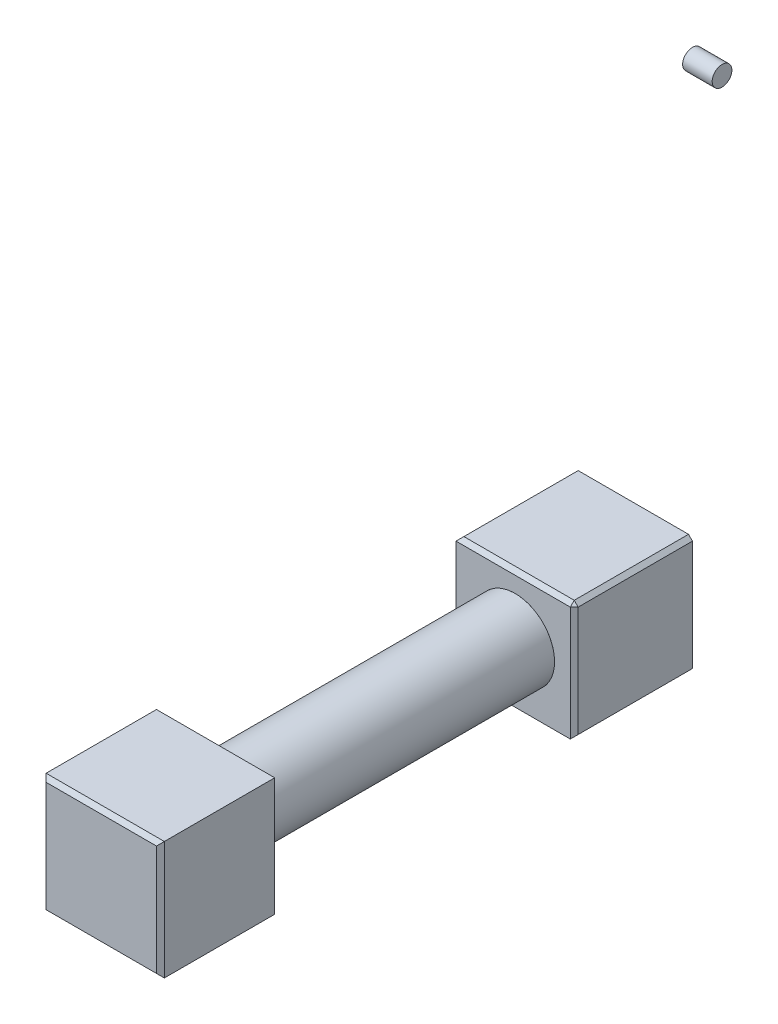
ISO-10303-21;
HEADER;
FILE_DESCRIPTION(('STEP AP214'),'2;1');
FILE_NAME('part.step','',(''),(''),'','','');
FILE_SCHEMA(('AUTOMOTIVE_DESIGN { 1 0 10303 214 1 1 1 1 }'));
ENDSEC;
DATA;
#1=APPLICATION_CONTEXT('core data for automotive mechanical design processes');
#2=APPLICATION_PROTOCOL_DEFINITION('international standard','automotive_design',2000,#1);
#3=PRODUCT_CONTEXT('',#1,'mechanical');
#4=PRODUCT('Part','Part','',(#3));
#5=PRODUCT_RELATED_PRODUCT_CATEGORY('part','',(#4));
#6=PRODUCT_DEFINITION_FORMATION('','',#4);
#7=PRODUCT_DEFINITION_CONTEXT('part definition',#1,'design');
#8=PRODUCT_DEFINITION('design','',#6,#7);
#9=PRODUCT_DEFINITION_SHAPE('','',#8);
#10=(LENGTH_UNIT() NAMED_UNIT(*) SI_UNIT(.MILLI.,.METRE.));
#11=(NAMED_UNIT(*) PLANE_ANGLE_UNIT() SI_UNIT($,.RADIAN.));
#12=(NAMED_UNIT(*) SI_UNIT($,.STERADIAN.) SOLID_ANGLE_UNIT());
#13=UNCERTAINTY_MEASURE_WITH_UNIT(LENGTH_MEASURE(1.E-05),#10,'distance_accuracy_value','');
#14=(GEOMETRIC_REPRESENTATION_CONTEXT(3) GLOBAL_UNCERTAINTY_ASSIGNED_CONTEXT((#13)) GLOBAL_UNIT_ASSIGNED_CONTEXT((#10,
#11,#12)) REPRESENTATION_CONTEXT('',''));
#15=CARTESIAN_POINT('',(0.,0.,0.));
#16=DIRECTION('',(0.,0.,1.));
#17=DIRECTION('',(1.,0.,0.));
#18=AXIS2_PLACEMENT_3D('',#15,#16,#17);
#19=CARTESIAN_POINT('',(45.,240.,0.));
#20=DIRECTION('',(-1.,0.,0.));
#21=DIRECTION('',(0.,0.,1.));
#22=AXIS2_PLACEMENT_3D('',#19,#20,#21);
#23=CYLINDRICAL_SURFACE('',#22,5.);
#24=CARTESIAN_POINT('',(45.,240.,0.));
#25=DIRECTION('',(1.,0.,0.));
#26=DIRECTION('',(0.,0.,-1.));
#27=AXIS2_PLACEMENT_3D('',#24,#25,#26);
#28=CIRCLE('',#27,5.);
#29=CARTESIAN_POINT('',(45.,240.,-5.));
#30=VERTEX_POINT('',#29);
#31=EDGE_CURVE('E11',#30,#30,#28,.T.);
#32=ORIENTED_EDGE('',*,*,#31,.F.);
#33=EDGE_LOOP('',(#32));
#34=FACE_BOUND('',#33,.T.);
#35=CARTESIAN_POINT('',(30.,240.,0.));
#36=DIRECTION('',(1.,0.,0.));
#37=DIRECTION('',(0.,0.,-1.));
#38=AXIS2_PLACEMENT_3D('',#35,#36,#37);
#39=CIRCLE('',#38,5.);
#40=CARTESIAN_POINT('',(30.,240.,-5.));
#41=VERTEX_POINT('',#40);
#42=EDGE_CURVE('E52',#41,#41,#39,.T.);
#43=ORIENTED_EDGE('',*,*,#42,.T.);
#44=EDGE_LOOP('',(#43));
#45=FACE_BOUND('',#44,.T.);
#46=ADVANCED_FACE('F49',(#34,#45),#23,.T.);
#47=CARTESIAN_POINT('',(45.,240.,0.));
#48=DIRECTION('',(1.,0.,0.));
#49=DIRECTION('',(0.,0.,-1.));
#50=AXIS2_PLACEMENT_3D('',#47,#48,#49);
#51=PLANE('',#50);
#52=ORIENTED_EDGE('',*,*,#31,.T.);
#53=EDGE_LOOP('',(#52));
#54=FACE_BOUND('',#53,.T.);
#55=ADVANCED_FACE('F65',(#54),#51,.T.);
#56=CARTESIAN_POINT('',(30.,240.,0.));
#57=DIRECTION('',(1.,0.,0.));
#58=DIRECTION('',(0.,0.,-1.));
#59=AXIS2_PLACEMENT_3D('',#56,#57,#58);
#60=PLANE('',#59);
#61=ORIENTED_EDGE('',*,*,#42,.F.);
#62=EDGE_LOOP('',(#61));
#63=FACE_BOUND('',#62,.T.);
#64=ADVANCED_FACE('F64',(#63),#60,.F.);
#65=CLOSED_SHELL('',(#46,#55,#64));
#66=MANIFOLD_SOLID_BREP('B2',#65);
#67=CARTESIAN_POINT('',(0.,0.,210.));
#68=DIRECTION('',(0.,0.,-1.));
#69=DIRECTION('',(-1.,0.,0.));
#70=AXIS2_PLACEMENT_3D('',#67,#68,#69);
#71=CYLINDRICAL_SURFACE('',#70,20.);
#72=CARTESIAN_POINT('',(0.,0.,210.));
#73=DIRECTION('',(0.,0.,1.));
#74=DIRECTION('',(1.,0.,0.));
#75=AXIS2_PLACEMENT_3D('',#72,#73,#74);
#76=CIRCLE('',#75,20.);
#77=CARTESIAN_POINT('',(20.,0.,210.));
#78=VERTEX_POINT('',#77);
#79=EDGE_CURVE('E184',#78,#78,#76,.T.);
#80=ORIENTED_EDGE('',*,*,#79,.F.);
#81=EDGE_LOOP('',(#80));
#82=FACE_BOUND('',#81,.T.);
#83=CARTESIAN_POINT('',(0.,0.,60.));
#84=DIRECTION('',(0.,0.,1.));
#85=DIRECTION('',(1.,0.,0.));
#86=AXIS2_PLACEMENT_3D('',#83,#84,#85);
#87=CIRCLE('',#86,20.);
#88=CARTESIAN_POINT('',(20.,0.,60.));
#89=VERTEX_POINT('',#88);
#90=EDGE_CURVE('E252',#89,#89,#87,.T.);
#91=ORIENTED_EDGE('',*,*,#90,.T.);
#92=EDGE_LOOP('',(#91));
#93=FACE_BOUND('',#92,.T.);
#94=ADVANCED_FACE('F99',(#82,#93),#71,.T.);
#95=CARTESIAN_POINT('',(0.,0.,60.));
#96=DIRECTION('',(0.,0.,1.));
#97=DIRECTION('',(1.,0.,0.));
#98=AXIS2_PLACEMENT_3D('',#95,#96,#97);
#99=PLANE('',#98);
#100=ORIENTED_EDGE('',*,*,#90,.F.);
#101=EDGE_LOOP('',(#100));
#102=FACE_BOUND('',#101,.T.);
#103=ADVANCED_FACE('F277',(#102),#99,.F.);
#104=CARTESIAN_POINT('',(30.,-30.,270.));
#105=DIRECTION('',(-1.,0.,0.));
#106=DIRECTION('',(0.,0.,1.));
#107=AXIS2_PLACEMENT_3D('',#104,#105,#106);
#108=PLANE('',#107);
#109=DIRECTION('',(0.,0.,-1.));
#110=VECTOR('',#109,1.);
#111=CARTESIAN_POINT('',(30.,30.,270.));
#112=LINE('',#111,#110);
#113=CARTESIAN_POINT('',(30.,30.,268.));
#114=VERTEX_POINT('',#113);
#115=CARTESIAN_POINT('',(30.,30.,212.));
#116=VERTEX_POINT('',#115);
#117=EDGE_CURVE('E250',#114,#116,#112,.T.);
#118=ORIENTED_EDGE('',*,*,#117,.F.);
#119=DIRECTION('',(0.,-1.,0.));
#120=VECTOR('',#119,1.);
#121=CARTESIAN_POINT('',(30.,-30.,268.));
#122=LINE('',#121,#120);
#123=CARTESIAN_POINT('',(30.,-30.,268.));
#124=VERTEX_POINT('',#123);
#125=EDGE_CURVE('E209',#114,#124,#122,.T.);
#126=ORIENTED_EDGE('',*,*,#125,.T.);
#127=DIRECTION('',(0.,0.,-1.));
#128=VECTOR('',#127,1.);
#129=CARTESIAN_POINT('',(30.,-30.,270.));
#130=LINE('',#129,#128);
#131=CARTESIAN_POINT('',(30.,-30.,212.));
#132=VERTEX_POINT('',#131);
#133=EDGE_CURVE('E238',#124,#132,#130,.T.);
#134=ORIENTED_EDGE('',*,*,#133,.T.);
#135=DIRECTION('',(0.,1.,0.));
#136=VECTOR('',#135,1.);
#137=CARTESIAN_POINT('',(30.,30.,212.));
#138=LINE('',#137,#136);
#139=EDGE_CURVE('E208',#132,#116,#138,.T.);
#140=ORIENTED_EDGE('',*,*,#139,.T.);
#141=EDGE_LOOP('',(#118,#126,#134,#140));
#142=FACE_BOUND('',#141,.T.);
#143=ADVANCED_FACE('F282',(#142),#108,.F.);
#144=CARTESIAN_POINT('',(-30.,30.,270.));
#145=DIRECTION('',(0.,-1.,0.));
#146=DIRECTION('',(0.,0.,-1.));
#147=AXIS2_PLACEMENT_3D('',#144,#145,#146);
#148=PLANE('',#147);
#149=DIRECTION('',(0.,0.,-1.));
#150=VECTOR('',#149,1.);
#151=CARTESIAN_POINT('',(-30.,30.,270.));
#152=LINE('',#151,#150);
#153=CARTESIAN_POINT('',(-30.,30.,268.));
#154=VERTEX_POINT('',#153);
#155=CARTESIAN_POINT('',(-30.,30.,212.));
#156=VERTEX_POINT('',#155);
#157=EDGE_CURVE('E248',#154,#156,#152,.T.);
#158=ORIENTED_EDGE('',*,*,#157,.F.);
#159=DIRECTION('',(1.,0.,0.));
#160=VECTOR('',#159,1.);
#161=CARTESIAN_POINT('',(-30.,30.,268.));
#162=LINE('',#161,#160);
#163=EDGE_CURVE('E206',#154,#114,#162,.T.);
#164=ORIENTED_EDGE('',*,*,#163,.T.);
#165=ORIENTED_EDGE('',*,*,#117,.T.);
#166=DIRECTION('',(-1.,0.,0.));
#167=VECTOR('',#166,1.);
#168=CARTESIAN_POINT('',(-30.,30.,212.));
#169=LINE('',#168,#167);
#170=EDGE_CURVE('E204',#116,#156,#169,.T.);
#171=ORIENTED_EDGE('',*,*,#170,.T.);
#172=EDGE_LOOP('',(#158,#164,#165,#171));
#173=FACE_BOUND('',#172,.T.);
#174=ADVANCED_FACE('F321',(#173),#148,.F.);
#175=CARTESIAN_POINT('',(-30.,-30.,270.));
#176=DIRECTION('',(1.,0.,0.));
#177=DIRECTION('',(0.,0.,-1.));
#178=AXIS2_PLACEMENT_3D('',#175,#176,#177);
#179=PLANE('',#178);
#180=DIRECTION('',(0.,0.,-1.));
#181=VECTOR('',#180,1.);
#182=CARTESIAN_POINT('',(-30.,-30.,270.));
#183=LINE('',#182,#181);
#184=CARTESIAN_POINT('',(-30.,-30.,268.));
#185=VERTEX_POINT('',#184);
#186=CARTESIAN_POINT('',(-30.,-30.,212.));
#187=VERTEX_POINT('',#186);
#188=EDGE_CURVE('E242',#185,#187,#183,.T.);
#189=ORIENTED_EDGE('',*,*,#188,.F.);
#190=DIRECTION('',(0.,1.,0.));
#191=VECTOR('',#190,1.);
#192=CARTESIAN_POINT('',(-30.,-30.,268.));
#193=LINE('',#192,#191);
#194=EDGE_CURVE('E205',#185,#154,#193,.T.);
#195=ORIENTED_EDGE('',*,*,#194,.T.);
#196=ORIENTED_EDGE('',*,*,#157,.T.);
#197=DIRECTION('',(0.,-1.,0.));
#198=VECTOR('',#197,1.);
#199=CARTESIAN_POINT('',(-30.,-30.,212.));
#200=LINE('',#199,#198);
#201=EDGE_CURVE('E200',#156,#187,#200,.T.);
#202=ORIENTED_EDGE('',*,*,#201,.T.);
#203=EDGE_LOOP('',(#189,#195,#196,#202));
#204=FACE_BOUND('',#203,.T.);
#205=ADVANCED_FACE('F266',(#204),#179,.F.);
#206=CARTESIAN_POINT('',(-30.,-30.,270.));
#207=DIRECTION('',(0.,1.,0.));
#208=DIRECTION('',(0.,0.,1.));
#209=AXIS2_PLACEMENT_3D('',#206,#207,#208);
#210=PLANE('',#209);
#211=ORIENTED_EDGE('',*,*,#133,.F.);
#212=DIRECTION('',(-1.,0.,0.));
#213=VECTOR('',#212,1.);
#214=CARTESIAN_POINT('',(-30.,-30.,268.));
#215=LINE('',#214,#213);
#216=EDGE_CURVE('E171',#124,#185,#215,.T.);
#217=ORIENTED_EDGE('',*,*,#216,.T.);
#218=ORIENTED_EDGE('',*,*,#188,.T.);
#219=DIRECTION('',(0.707106781186548,0.,-0.707106781186548));
#220=VECTOR('',#219,1.);
#221=CARTESIAN_POINT('',(-30.,-30.,212.));
#222=LINE('',#221,#220);
#223=CARTESIAN_POINT('',(-28.,-30.,210.));
#224=VERTEX_POINT('',#223);
#225=EDGE_CURVE('E194',#187,#224,#222,.T.);
#226=ORIENTED_EDGE('',*,*,#225,.T.);
#227=DIRECTION('',(1.,0.,0.));
#228=VECTOR('',#227,1.);
#229=CARTESIAN_POINT('',(-30.,-30.,210.));
#230=LINE('',#229,#228);
#231=CARTESIAN_POINT('',(28.,-30.,210.));
#232=VERTEX_POINT('',#231);
#233=EDGE_CURVE('E218',#224,#232,#230,.T.);
#234=ORIENTED_EDGE('',*,*,#233,.T.);
#235=DIRECTION('',(0.707106781186548,0.,0.707106781186548));
#236=VECTOR('',#235,1.);
#237=CARTESIAN_POINT('',(30.,-30.,212.));
#238=LINE('',#237,#236);
#239=EDGE_CURVE('E190',#232,#132,#238,.T.);
#240=ORIENTED_EDGE('',*,*,#239,.T.);
#241=EDGE_LOOP('',(#211,#217,#218,#226,#234,#240));
#242=FACE_BOUND('',#241,.T.);
#243=ADVANCED_FACE('F240',(#242),#210,.F.);
#244=CARTESIAN_POINT('',(0.,0.,270.));
#245=DIRECTION('',(0.,0.,-1.));
#246=DIRECTION('',(-1.,0.,0.));
#247=AXIS2_PLACEMENT_3D('',#244,#245,#246);
#248=PLANE('',#247);
#249=DIRECTION('',(0.,-1.,0.));
#250=VECTOR('',#249,1.);
#251=CARTESIAN_POINT('',(-28.,0.,270.));
#252=LINE('',#251,#250);
#253=CARTESIAN_POINT('',(-28.,28.,270.));
#254=VERTEX_POINT('',#253);
#255=CARTESIAN_POINT('',(-28.,-28.,270.));
#256=VERTEX_POINT('',#255);
#257=EDGE_CURVE('E189',#254,#256,#252,.T.);
#258=ORIENTED_EDGE('',*,*,#257,.T.);
#259=DIRECTION('',(1.,0.,0.));
#260=VECTOR('',#259,1.);
#261=CARTESIAN_POINT('',(0.,-28.,270.));
#262=LINE('',#261,#260);
#263=CARTESIAN_POINT('',(28.,-28.,270.));
#264=VERTEX_POINT('',#263);
#265=EDGE_CURVE('E166',#256,#264,#262,.T.);
#266=ORIENTED_EDGE('',*,*,#265,.T.);
#267=DIRECTION('',(0.,1.,0.));
#268=VECTOR('',#267,1.);
#269=CARTESIAN_POINT('',(28.,0.,270.));
#270=LINE('',#269,#268);
#271=CARTESIAN_POINT('',(28.,28.,270.));
#272=VERTEX_POINT('',#271);
#273=EDGE_CURVE('E179',#264,#272,#270,.T.);
#274=ORIENTED_EDGE('',*,*,#273,.T.);
#275=DIRECTION('',(-1.,0.,0.));
#276=VECTOR('',#275,1.);
#277=CARTESIAN_POINT('',(0.,28.,270.));
#278=LINE('',#277,#276);
#279=EDGE_CURVE('E181',#272,#254,#278,.T.);
#280=ORIENTED_EDGE('',*,*,#279,.T.);
#281=EDGE_LOOP('',(#258,#266,#274,#280));
#282=FACE_BOUND('',#281,.T.);
#283=ADVANCED_FACE('F186',(#282),#248,.F.);
#284=CARTESIAN_POINT('',(0.,0.,210.));
#285=DIRECTION('',(0.,0.,-1.));
#286=DIRECTION('',(-1.,0.,0.));
#287=AXIS2_PLACEMENT_3D('',#284,#285,#286);
#288=PLANE('',#287);
#289=ORIENTED_EDGE('',*,*,#79,.T.);
#290=EDGE_LOOP('',(#289));
#291=FACE_BOUND('',#290,.T.);
#292=ORIENTED_EDGE('',*,*,#233,.F.);
#293=DIRECTION('',(0.,1.,0.));
#294=VECTOR('',#293,1.);
#295=CARTESIAN_POINT('',(-28.,30.,210.));
#296=LINE('',#295,#294);
#297=CARTESIAN_POINT('',(-28.,28.,210.));
#298=VERTEX_POINT('',#297);
#299=EDGE_CURVE('E48',#224,#298,#296,.T.);
#300=ORIENTED_EDGE('',*,*,#299,.T.);
#301=DIRECTION('',(1.,0.,0.));
#302=VECTOR('',#301,1.);
#303=CARTESIAN_POINT('',(30.,28.,210.));
#304=LINE('',#303,#302);
#305=CARTESIAN_POINT('',(28.,28.,210.));
#306=VERTEX_POINT('',#305);
#307=EDGE_CURVE('E109',#298,#306,#304,.T.);
#308=ORIENTED_EDGE('',*,*,#307,.T.);
#309=DIRECTION('',(0.,-1.,0.));
#310=VECTOR('',#309,1.);
#311=CARTESIAN_POINT('',(28.,-30.,210.));
#312=LINE('',#311,#310);
#313=EDGE_CURVE('E215',#306,#232,#312,.T.);
#314=ORIENTED_EDGE('',*,*,#313,.T.);
#315=EDGE_LOOP('',(#292,#300,#308,#314));
#316=FACE_BOUND('',#315,.T.);
#317=ADVANCED_FACE('F235',(#291,#316),#288,.T.);
#318=CARTESIAN_POINT('',(0.,28.,270.));
#319=DIRECTION('',(0.,-0.707106781186547,-0.707106781186547));
#320=DIRECTION('',(-1.,0.,0.));
#321=AXIS2_PLACEMENT_3D('',#318,#319,#320);
#322=PLANE('',#321);
#323=DIRECTION('',(-0.577350269189626,-0.577350269189626,0.577350269189626));
#324=VECTOR('',#323,1.);
#325=CARTESIAN_POINT('',(18.6666666666667,18.6666666666667,279.333333333333));
#326=LINE('',#325,#324);
#327=EDGE_CURVE('E176',#114,#272,#326,.T.);
#328=ORIENTED_EDGE('',*,*,#327,.F.);
#329=ORIENTED_EDGE('',*,*,#163,.F.);
#330=DIRECTION('',(0.577350269189626,-0.577350269189626,0.577350269189626));
#331=VECTOR('',#330,1.);
#332=CARTESIAN_POINT('',(-18.6666666666667,18.6666666666667,279.333333333333));
#333=LINE('',#332,#331);
#334=EDGE_CURVE('E220',#254,#154,#333,.F.);
#335=ORIENTED_EDGE('',*,*,#334,.F.);
#336=ORIENTED_EDGE('',*,*,#279,.F.);
#337=EDGE_LOOP('',(#328,#329,#335,#336));
#338=FACE_BOUND('',#337,.T.);
#339=ADVANCED_FACE('F259',(#338),#322,.F.);
#340=CARTESIAN_POINT('',(-28.,0.,270.));
#341=DIRECTION('',(0.707106781186547,0.,-0.707106781186547));
#342=DIRECTION('',(0.,-1.,0.));
#343=AXIS2_PLACEMENT_3D('',#340,#341,#342);
#344=PLANE('',#343);
#345=ORIENTED_EDGE('',*,*,#334,.T.);
#346=ORIENTED_EDGE('',*,*,#194,.F.);
#347=DIRECTION('',(0.577350269189626,0.577350269189626,0.577350269189626));
#348=VECTOR('',#347,1.);
#349=CARTESIAN_POINT('',(-18.6666666666667,-18.6666666666667,279.333333333333));
#350=LINE('',#349,#348);
#351=EDGE_CURVE('E173',#256,#185,#350,.F.);
#352=ORIENTED_EDGE('',*,*,#351,.F.);
#353=ORIENTED_EDGE('',*,*,#257,.F.);
#354=EDGE_LOOP('',(#345,#346,#352,#353));
#355=FACE_BOUND('',#354,.T.);
#356=ADVANCED_FACE('F265',(#355),#344,.F.);
#357=CARTESIAN_POINT('',(28.,0.,270.));
#358=DIRECTION('',(-0.707106781186547,0.,-0.707106781186547));
#359=DIRECTION('',(0.,1.,0.));
#360=AXIS2_PLACEMENT_3D('',#357,#358,#359);
#361=PLANE('',#360);
#362=ORIENTED_EDGE('',*,*,#327,.T.);
#363=ORIENTED_EDGE('',*,*,#273,.F.);
#364=DIRECTION('',(0.577350269189626,-0.577350269189626,-0.577350269189626));
#365=VECTOR('',#364,1.);
#366=CARTESIAN_POINT('',(18.6666666666667,-18.6666666666667,279.333333333333));
#367=LINE('',#366,#365);
#368=EDGE_CURVE('E164',#124,#264,#367,.F.);
#369=ORIENTED_EDGE('',*,*,#368,.F.);
#370=ORIENTED_EDGE('',*,*,#125,.F.);
#371=EDGE_LOOP('',(#362,#363,#369,#370));
#372=FACE_BOUND('',#371,.T.);
#373=ADVANCED_FACE('F177',(#372),#361,.F.);
#374=CARTESIAN_POINT('',(0.,-28.,270.));
#375=DIRECTION('',(0.,0.707106781186547,-0.707106781186547));
#376=DIRECTION('',(1.,0.,0.));
#377=AXIS2_PLACEMENT_3D('',#374,#375,#376);
#378=PLANE('',#377);
#379=ORIENTED_EDGE('',*,*,#351,.T.);
#380=ORIENTED_EDGE('',*,*,#216,.F.);
#381=ORIENTED_EDGE('',*,*,#368,.T.);
#382=ORIENTED_EDGE('',*,*,#265,.F.);
#383=EDGE_LOOP('',(#379,#380,#381,#382));
#384=FACE_BOUND('',#383,.T.);
#385=ADVANCED_FACE('F170',(#384),#378,.F.);
#386=CARTESIAN_POINT('',(30.,-30.,212.));
#387=DIRECTION('',(0.707106781186547,0.,-0.707106781186547));
#388=DIRECTION('',(0.,-1.,0.));
#389=AXIS2_PLACEMENT_3D('',#386,#387,#388);
#390=PLANE('',#389);
#391=ORIENTED_EDGE('',*,*,#239,.F.);
#392=ORIENTED_EDGE('',*,*,#313,.F.);
#393=DIRECTION('',(0.577350269189626,0.577350269189626,0.577350269189626));
#394=VECTOR('',#393,1.);
#395=CARTESIAN_POINT('',(10.,10.,192.));
#396=LINE('',#395,#394);
#397=EDGE_CURVE('E104',#116,#306,#396,.F.);
#398=ORIENTED_EDGE('',*,*,#397,.F.);
#399=ORIENTED_EDGE('',*,*,#139,.F.);
#400=EDGE_LOOP('',(#391,#392,#398,#399));
#401=FACE_BOUND('',#400,.T.);
#402=ADVANCED_FACE('F103',(#401),#390,.T.);
#403=CARTESIAN_POINT('',(-30.,30.,212.));
#404=DIRECTION('',(0.,0.707106781186547,-0.707106781186547));
#405=DIRECTION('',(1.,0.,0.));
#406=AXIS2_PLACEMENT_3D('',#403,#404,#405);
#407=PLANE('',#406);
#408=ORIENTED_EDGE('',*,*,#397,.T.);
#409=ORIENTED_EDGE('',*,*,#307,.F.);
#410=DIRECTION('',(-0.577350269189626,0.577350269189626,0.577350269189626));
#411=VECTOR('',#410,1.);
#412=CARTESIAN_POINT('',(-30.,30.,212.));
#413=LINE('',#412,#411);
#414=EDGE_CURVE('E219',#156,#298,#413,.F.);
#415=ORIENTED_EDGE('',*,*,#414,.F.);
#416=ORIENTED_EDGE('',*,*,#170,.F.);
#417=EDGE_LOOP('',(#408,#409,#415,#416));
#418=FACE_BOUND('',#417,.T.);
#419=ADVANCED_FACE('F228',(#418),#407,.T.);
#420=CARTESIAN_POINT('',(-30.,-30.,212.));
#421=DIRECTION('',(-0.707106781186547,0.,-0.707106781186547));
#422=DIRECTION('',(0.,1.,0.));
#423=AXIS2_PLACEMENT_3D('',#420,#421,#422);
#424=PLANE('',#423);
#425=ORIENTED_EDGE('',*,*,#414,.T.);
#426=ORIENTED_EDGE('',*,*,#299,.F.);
#427=ORIENTED_EDGE('',*,*,#225,.F.);
#428=ORIENTED_EDGE('',*,*,#201,.F.);
#429=EDGE_LOOP('',(#425,#426,#427,#428));
#430=FACE_BOUND('',#429,.T.);
#431=ADVANCED_FACE('F270',(#430),#424,.T.);
#432=CLOSED_SHELL('',(#94,#103,#143,#174,#205,#243,#283,#317,#339,#356,#373,#385,#402,#419,#431));
#433=MANIFOLD_SOLID_BREP('B6',#432);
#434=CARTESIAN_POINT('',(30.,-30.,60.));
#435=DIRECTION('',(-1.,0.,0.));
#436=DIRECTION('',(0.,0.,1.));
#437=AXIS2_PLACEMENT_3D('',#434,#435,#436);
#438=PLANE('',#437);
#439=DIRECTION('',(0.,-1.,0.));
#440=VECTOR('',#439,1.);
#441=CARTESIAN_POINT('',(30.,-30.,58.));
#442=LINE('',#441,#440);
#443=CARTESIAN_POINT('',(30.,28.,58.));
#444=VERTEX_POINT('',#443);
#445=CARTESIAN_POINT('',(30.,-28.,58.));
#446=VERTEX_POINT('',#445);
#447=EDGE_CURVE('E437',#444,#446,#442,.T.);
#448=ORIENTED_EDGE('',*,*,#447,.T.);
#449=DIRECTION('',(0.,0.,-1.));
#450=VECTOR('',#449,1.);
#451=CARTESIAN_POINT('',(30.,-28.,60.));
#452=LINE('',#451,#450);
#453=CARTESIAN_POINT('',(30.,-28.,0.));
#454=VERTEX_POINT('',#453);
#455=EDGE_CURVE('E98',#446,#454,#452,.T.);
#456=ORIENTED_EDGE('',*,*,#455,.T.);
#457=DIRECTION('',(0.,1.,0.));
#458=VECTOR('',#457,1.);
#459=CARTESIAN_POINT('',(30.,-30.,0.));
#460=LINE('',#459,#458);
#461=CARTESIAN_POINT('',(30.,28.,0.));
#462=VERTEX_POINT('',#461);
#463=EDGE_CURVE('E571',#454,#462,#460,.T.);
#464=ORIENTED_EDGE('',*,*,#463,.T.);
#465=DIRECTION('',(0.,0.,1.));
#466=VECTOR('',#465,1.);
#467=CARTESIAN_POINT('',(30.,28.,60.));
#468=LINE('',#467,#466);
#469=EDGE_CURVE('E431',#462,#444,#468,.T.);
#470=ORIENTED_EDGE('',*,*,#469,.T.);
#471=EDGE_LOOP('',(#448,#456,#464,#470));
#472=FACE_BOUND('',#471,.T.);
#473=ADVANCED_FACE('F423',(#472),#438,.F.);
#474=CARTESIAN_POINT('',(-30.,30.,60.));
#475=DIRECTION('',(0.,-1.,0.));
#476=DIRECTION('',(0.,0.,-1.));
#477=AXIS2_PLACEMENT_3D('',#474,#475,#476);
#478=PLANE('',#477);
#479=DIRECTION('',(-1.,0.,0.));
#480=VECTOR('',#479,1.);
#481=CARTESIAN_POINT('',(-30.,30.,0.));
#482=LINE('',#481,#480);
#483=CARTESIAN_POINT('',(28.,30.,0.));
#484=VERTEX_POINT('',#483);
#485=CARTESIAN_POINT('',(-28.,30.,0.));
#486=VERTEX_POINT('',#485);
#487=EDGE_CURVE('E524',#484,#486,#482,.T.);
#488=ORIENTED_EDGE('',*,*,#487,.T.);
#489=DIRECTION('',(0.,0.,1.));
#490=VECTOR('',#489,1.);
#491=CARTESIAN_POINT('',(-28.,30.,60.));
#492=LINE('',#491,#490);
#493=CARTESIAN_POINT('',(-28.,30.,58.));
#494=VERTEX_POINT('',#493);
#495=EDGE_CURVE('E543',#486,#494,#492,.T.);
#496=ORIENTED_EDGE('',*,*,#495,.T.);
#497=DIRECTION('',(1.,0.,0.));
#498=VECTOR('',#497,1.);
#499=CARTESIAN_POINT('',(-30.,30.,58.));
#500=LINE('',#499,#498);
#501=CARTESIAN_POINT('',(28.,30.,58.));
#502=VERTEX_POINT('',#501);
#503=EDGE_CURVE('E537',#494,#502,#500,.T.);
#504=ORIENTED_EDGE('',*,*,#503,.T.);
#505=DIRECTION('',(0.,0.,-1.));
#506=VECTOR('',#505,1.);
#507=CARTESIAN_POINT('',(28.,30.,60.));
#508=LINE('',#507,#506);
#509=EDGE_CURVE('E541',#502,#484,#508,.T.);
#510=ORIENTED_EDGE('',*,*,#509,.T.);
#511=EDGE_LOOP('',(#488,#496,#504,#510));
#512=FACE_BOUND('',#511,.T.);
#513=ADVANCED_FACE('F580',(#512),#478,.F.);
#514=CARTESIAN_POINT('',(-30.,-30.,60.));
#515=DIRECTION('',(1.,0.,0.));
#516=DIRECTION('',(0.,0.,-1.));
#517=AXIS2_PLACEMENT_3D('',#514,#515,#516);
#518=PLANE('',#517);
#519=DIRECTION('',(0.,-1.,0.));
#520=VECTOR('',#519,1.);
#521=CARTESIAN_POINT('',(-30.,-30.,0.));
#522=LINE('',#521,#520);
#523=CARTESIAN_POINT('',(-30.,28.,0.));
#524=VERTEX_POINT('',#523);
#525=CARTESIAN_POINT('',(-30.,-28.,0.));
#526=VERTEX_POINT('',#525);
#527=EDGE_CURVE('E519',#524,#526,#522,.T.);
#528=ORIENTED_EDGE('',*,*,#527,.T.);
#529=DIRECTION('',(0.,0.,1.));
#530=VECTOR('',#529,1.);
#531=CARTESIAN_POINT('',(-30.,-28.,60.));
#532=LINE('',#531,#530);
#533=CARTESIAN_POINT('',(-30.,-28.,60.));
#534=VERTEX_POINT('',#533);
#535=EDGE_CURVE('E493',#526,#534,#532,.T.);
#536=ORIENTED_EDGE('',*,*,#535,.T.);
#537=DIRECTION('',(0.,-1.,0.));
#538=VECTOR('',#537,1.);
#539=CARTESIAN_POINT('',(-30.,-30.,60.));
#540=LINE('',#539,#538);
#541=CARTESIAN_POINT('',(-30.,28.,60.));
#542=VERTEX_POINT('',#541);
#543=EDGE_CURVE('E517',#542,#534,#540,.T.);
#544=ORIENTED_EDGE('',*,*,#543,.F.);
#545=DIRECTION('',(0.,0.,-1.));
#546=VECTOR('',#545,1.);
#547=CARTESIAN_POINT('',(-30.,28.,60.));
#548=LINE('',#547,#546);
#549=EDGE_CURVE('E496',#542,#524,#548,.T.);
#550=ORIENTED_EDGE('',*,*,#549,.T.);
#551=EDGE_LOOP('',(#528,#536,#544,#550));
#552=FACE_BOUND('',#551,.T.);
#553=ADVANCED_FACE('F598',(#552),#518,.F.);
#554=CARTESIAN_POINT('',(-30.,-30.,60.));
#555=DIRECTION('',(0.,1.,0.));
#556=DIRECTION('',(0.,0.,1.));
#557=AXIS2_PLACEMENT_3D('',#554,#555,#556);
#558=PLANE('',#557);
#559=DIRECTION('',(1.,0.,0.));
#560=VECTOR('',#559,1.);
#561=CARTESIAN_POINT('',(-30.,-30.,60.));
#562=LINE('',#561,#560);
#563=CARTESIAN_POINT('',(-28.,-30.,60.));
#564=VERTEX_POINT('',#563);
#565=CARTESIAN_POINT('',(28.,-30.,60.));
#566=VERTEX_POINT('',#565);
#567=EDGE_CURVE('E510',#564,#566,#562,.T.);
#568=ORIENTED_EDGE('',*,*,#567,.F.);
#569=DIRECTION('',(0.,0.,-1.));
#570=VECTOR('',#569,1.);
#571=CARTESIAN_POINT('',(-28.,-30.,60.));
#572=LINE('',#571,#570);
#573=CARTESIAN_POINT('',(-28.,-30.,0.));
#574=VERTEX_POINT('',#573);
#575=EDGE_CURVE('E492',#564,#574,#572,.T.);
#576=ORIENTED_EDGE('',*,*,#575,.T.);
#577=DIRECTION('',(1.,0.,0.));
#578=VECTOR('',#577,1.);
#579=CARTESIAN_POINT('',(-30.,-30.,0.));
#580=LINE('',#579,#578);
#581=CARTESIAN_POINT('',(28.,-30.,0.));
#582=VERTEX_POINT('',#581);
#583=EDGE_CURVE('E508',#574,#582,#580,.T.);
#584=ORIENTED_EDGE('',*,*,#583,.T.);
#585=DIRECTION('',(0.,0.,1.));
#586=VECTOR('',#585,1.);
#587=CARTESIAN_POINT('',(28.,-30.,60.));
#588=LINE('',#587,#586);
#589=EDGE_CURVE('E512',#582,#566,#588,.T.);
#590=ORIENTED_EDGE('',*,*,#589,.T.);
#591=EDGE_LOOP('',(#568,#576,#584,#590));
#592=FACE_BOUND('',#591,.T.);
#593=ADVANCED_FACE('F505',(#592),#558,.F.);
#594=CARTESIAN_POINT('',(0.,0.,60.));
#595=DIRECTION('',(0.,0.,-1.));
#596=DIRECTION('',(-1.,0.,0.));
#597=AXIS2_PLACEMENT_3D('',#594,#595,#596);
#598=PLANE('',#597);
#599=CARTESIAN_POINT('',(0.,0.,60.));
#600=DIRECTION('',(0.,0.,-1.));
#601=DIRECTION('',(-1.,0.,0.));
#602=AXIS2_PLACEMENT_3D('',#599,#600,#601);
#603=CIRCLE('',#602,20.);
#604=CARTESIAN_POINT('',(-20.,0.,60.));
#605=VERTEX_POINT('',#604);
#606=EDGE_CURVE('E567',#605,#605,#603,.F.);
#607=ORIENTED_EDGE('',*,*,#606,.F.);
#608=EDGE_LOOP('',(#607));
#609=FACE_BOUND('',#608,.T.);
#610=ORIENTED_EDGE('',*,*,#543,.T.);
#611=DIRECTION('',(-0.707106781186545,0.70710678118655,0.));
#612=VECTOR('',#611,1.);
#613=CARTESIAN_POINT('',(-28.,-30.,60.));
#614=LINE('',#613,#612);
#615=EDGE_CURVE('E540',#534,#564,#614,.F.);
#616=ORIENTED_EDGE('',*,*,#615,.T.);
#617=ORIENTED_EDGE('',*,*,#567,.T.);
#618=DIRECTION('',(0.,1.,0.));
#619=VECTOR('',#618,1.);
#620=CARTESIAN_POINT('',(28.,0.,60.));
#621=LINE('',#620,#619);
#622=CARTESIAN_POINT('',(28.,28.,60.));
#623=VERTEX_POINT('',#622);
#624=EDGE_CURVE('E532',#566,#623,#621,.T.);
#625=ORIENTED_EDGE('',*,*,#624,.T.);
#626=DIRECTION('',(-1.,0.,0.));
#627=VECTOR('',#626,1.);
#628=CARTESIAN_POINT('',(0.,28.,60.));
#629=LINE('',#628,#627);
#630=EDGE_CURVE('E531',#623,#542,#629,.T.);
#631=ORIENTED_EDGE('',*,*,#630,.T.);
#632=EDGE_LOOP('',(#610,#616,#617,#625,#631));
#633=FACE_BOUND('',#632,.T.);
#634=ADVANCED_FACE('F592',(#609,#633),#598,.F.);
#635=CARTESIAN_POINT('',(0.,0.,0.));
#636=DIRECTION('',(0.,0.,-1.));
#637=DIRECTION('',(-1.,0.,0.));
#638=AXIS2_PLACEMENT_3D('',#635,#636,#637);
#639=PLANE('',#638);
#640=CARTESIAN_POINT('',(0.,0.,0.));
#641=DIRECTION('',(0.,0.,1.));
#642=DIRECTION('',(1.,0.,0.));
#643=AXIS2_PLACEMENT_3D('',#640,#641,#642);
#644=CIRCLE('',#643,20.);
#645=CARTESIAN_POINT('',(-20.,0.,0.));
#646=VERTEX_POINT('',#645);
#647=EDGE_CURVE('E563',#646,#646,#644,.T.);
#648=ORIENTED_EDGE('',*,*,#647,.T.);
#649=EDGE_LOOP('',(#648));
#650=FACE_BOUND('',#649,.T.);
#651=ORIENTED_EDGE('',*,*,#583,.F.);
#652=DIRECTION('',(0.707106781186545,-0.70710678118655,0.));
#653=VECTOR('',#652,1.);
#654=CARTESIAN_POINT('',(-29.0000000000001,-28.9999999999999,0.));
#655=LINE('',#654,#653);
#656=EDGE_CURVE('E487',#574,#526,#655,.F.);
#657=ORIENTED_EDGE('',*,*,#656,.T.);
#658=ORIENTED_EDGE('',*,*,#527,.F.);
#659=DIRECTION('',(-0.70710678118655,-0.707106781186545,0.));
#660=VECTOR('',#659,1.);
#661=CARTESIAN_POINT('',(-28.9999999999999,29.0000000000001,0.));
#662=LINE('',#661,#660);
#663=EDGE_CURVE('E498',#524,#486,#662,.F.);
#664=ORIENTED_EDGE('',*,*,#663,.T.);
#665=ORIENTED_EDGE('',*,*,#487,.F.);
#666=DIRECTION('',(-0.70710678118655,0.707106781186545,0.));
#667=VECTOR('',#666,1.);
#668=CARTESIAN_POINT('',(28.9999999999999,29.0000000000001,0.));
#669=LINE('',#668,#667);
#670=EDGE_CURVE('E506',#484,#462,#669,.F.);
#671=ORIENTED_EDGE('',*,*,#670,.T.);
#672=ORIENTED_EDGE('',*,*,#463,.F.);
#673=DIRECTION('',(0.70710678118655,0.707106781186545,0.));
#674=VECTOR('',#673,1.);
#675=CARTESIAN_POINT('',(28.9999999999999,-29.0000000000001,0.));
#676=LINE('',#675,#674);
#677=EDGE_CURVE('E516',#454,#582,#676,.F.);
#678=ORIENTED_EDGE('',*,*,#677,.T.);
#679=EDGE_LOOP('',(#651,#657,#658,#664,#665,#671,#672,#678));
#680=FACE_BOUND('',#679,.T.);
#681=ADVANCED_FACE('F511',(#650,#680),#639,.T.);
#682=CARTESIAN_POINT('',(0.,0.,61.));
#683=DIRECTION('',(0.,0.,-1.));
#684=DIRECTION('',(-1.,0.,0.));
#685=AXIS2_PLACEMENT_3D('',#682,#683,#684);
#686=CYLINDRICAL_SURFACE('',#685,20.);
#687=CARTESIAN_POINT('',(-20.,0.,0.));
#688=CARTESIAN_POINT('',(-20.,0.,0.624999999999994));
#689=CARTESIAN_POINT('',(-20.,0.,1.24999999999999));
#690=CARTESIAN_POINT('',(-20.,0.,2.5));
#691=CARTESIAN_POINT('',(-20.,0.,3.125));
#692=CARTESIAN_POINT('',(-20.,0.,4.375));
#693=CARTESIAN_POINT('',(-20.,0.,5.));
#694=CARTESIAN_POINT('',(-20.,0.,6.25));
#695=CARTESIAN_POINT('',(-20.,0.,6.87499999999999));
#696=CARTESIAN_POINT('',(-20.,0.,8.12499999999999));
#697=CARTESIAN_POINT('',(-20.,0.,8.74999999999999));
#698=CARTESIAN_POINT('',(-20.,0.,9.99999999999999));
#699=CARTESIAN_POINT('',(-20.,0.,10.625));
#700=CARTESIAN_POINT('',(-20.,0.,11.875));
#701=CARTESIAN_POINT('',(-20.,0.,12.5));
#702=CARTESIAN_POINT('',(-20.,0.,13.75));
#703=CARTESIAN_POINT('',(-20.,0.,14.375));
#704=CARTESIAN_POINT('',(-20.,0.,15.625));
#705=CARTESIAN_POINT('',(-20.,0.,16.25));
#706=CARTESIAN_POINT('',(-20.,0.,17.5));
#707=CARTESIAN_POINT('',(-20.,0.,18.125));
#708=CARTESIAN_POINT('',(-20.,0.,19.375));
#709=CARTESIAN_POINT('',(-20.,0.,20.));
#710=CARTESIAN_POINT('',(-20.,0.,21.25));
#711=CARTESIAN_POINT('',(-20.,0.,21.875));
#712=CARTESIAN_POINT('',(-20.,0.,23.125));
#713=CARTESIAN_POINT('',(-20.,0.,23.75));
#714=CARTESIAN_POINT('',(-20.,0.,25.));
#715=CARTESIAN_POINT('',(-20.,0.,25.625));
#716=CARTESIAN_POINT('',(-20.,0.,26.875));
#717=CARTESIAN_POINT('',(-20.,0.,27.5));
#718=CARTESIAN_POINT('',(-20.,0.,28.75));
#719=CARTESIAN_POINT('',(-20.,0.,29.375));
#720=CARTESIAN_POINT('',(-20.,0.,30.625));
#721=CARTESIAN_POINT('',(-20.,0.,31.25));
#722=CARTESIAN_POINT('',(-20.,0.,32.5));
#723=CARTESIAN_POINT('',(-20.,0.,33.125));
#724=CARTESIAN_POINT('',(-20.,0.,34.375));
#725=CARTESIAN_POINT('',(-20.,0.,35.));
#726=CARTESIAN_POINT('',(-20.,0.,36.25));
#727=CARTESIAN_POINT('',(-20.,0.,36.875));
#728=CARTESIAN_POINT('',(-20.,0.,38.125));
#729=CARTESIAN_POINT('',(-20.,0.,38.75));
#730=CARTESIAN_POINT('',(-20.,0.,40.));
#731=CARTESIAN_POINT('',(-20.,0.,40.625));
#732=CARTESIAN_POINT('',(-20.,0.,41.875));
#733=CARTESIAN_POINT('',(-20.,0.,42.5));
#734=CARTESIAN_POINT('',(-20.,0.,43.75));
#735=CARTESIAN_POINT('',(-20.,0.,44.375));
#736=CARTESIAN_POINT('',(-20.,0.,45.625));
#737=CARTESIAN_POINT('',(-20.,0.,46.25));
#738=CARTESIAN_POINT('',(-20.,0.,47.5));
#739=CARTESIAN_POINT('',(-20.,0.,48.125));
#740=CARTESIAN_POINT('',(-20.,0.,49.375));
#741=CARTESIAN_POINT('',(-20.,0.,50.));
#742=CARTESIAN_POINT('',(-20.,0.,51.25));
#743=CARTESIAN_POINT('',(-20.,0.,51.875));
#744=CARTESIAN_POINT('',(-20.,0.,53.125));
#745=CARTESIAN_POINT('',(-20.,0.,53.75));
#746=CARTESIAN_POINT('',(-20.,0.,55.));
#747=CARTESIAN_POINT('',(-20.,0.,55.625));
#748=CARTESIAN_POINT('',(-20.,0.,56.875));
#749=CARTESIAN_POINT('',(-20.,0.,57.5));
#750=CARTESIAN_POINT('',(-20.,0.,58.75));
#751=CARTESIAN_POINT('',(-20.,0.,59.375));
#752=CARTESIAN_POINT('',(-20.,0.,60.));
#753=B_SPLINE_CURVE_WITH_KNOTS('',3,(#687,#688,#689,#690,#691,#692,#693,#694,#695,#696,#697,
#698,#699,#700,#701,#702,#703,#704,#705,#706,#707,#708,#709,#710,#711,#712,#713,#714,#715,#716,
#717,#718,#719,#720,#721,#722,#723,#724,#725,#726,#727,#728,#729,#730,#731,#732,#733,#734,#735,
#736,#737,#738,#739,#740,#741,#742,#743,#744,#745,#746,#747,#748,#749,#750,#751,#752),
.UNSPECIFIED.,.F.,.F.,(4,2,2,2,2,2,2,2,2,2,2,2,2,2,2,2,2,2,2,2,2,2,2,2,2,2,2,2,2,2,2,2,4),(0.,
1.875,3.75,5.62500000000001,7.5,9.375,11.25,13.125,15.,16.875,18.75,20.625,22.5,24.375,26.25,
28.125,30.,31.875,33.75,35.625,37.5,39.375,41.25,43.125,45.,46.875,48.75,50.625,52.5,54.375,
56.25,58.125,60.),.UNSPECIFIED.);
#754=EDGE_CURVE('BSEAM617',#646,#605,#753,.T.);
#755=ORIENTED_EDGE('',*,*,#647,.F.);
#756=ORIENTED_EDGE('',*,*,#606,.T.);
#757=ORIENTED_EDGE('',*,*,#754,.T.);
#758=ORIENTED_EDGE('',*,*,#754,.F.);
#759=EDGE_LOOP('',(#755,#757,#756,#758));
#760=FACE_BOUND('',#759,.T.);
#761=ADVANCED_FACE('F617',(#760),#686,.F.);
#762=CARTESIAN_POINT('',(-28.,-30.,60.));
#763=DIRECTION('',(0.70710678118655,0.707106781186545,0.));
#764=DIRECTION('',(0.,0.,-1.));
#765=AXIS2_PLACEMENT_3D('',#762,#763,#764);
#766=PLANE('',#765);
#767=ORIENTED_EDGE('',*,*,#615,.F.);
#768=ORIENTED_EDGE('',*,*,#535,.F.);
#769=ORIENTED_EDGE('',*,*,#656,.F.);
#770=ORIENTED_EDGE('',*,*,#575,.F.);
#771=EDGE_LOOP('',(#767,#768,#769,#770));
#772=FACE_BOUND('',#771,.T.);
#773=ADVANCED_FACE('F495',(#772),#766,.F.);
#774=CARTESIAN_POINT('',(30.,-28.,60.));
#775=DIRECTION('',(-0.707106781186545,0.70710678118655,0.));
#776=DIRECTION('',(0.,0.,-1.));
#777=AXIS2_PLACEMENT_3D('',#774,#775,#776);
#778=PLANE('',#777);
#779=ORIENTED_EDGE('',*,*,#677,.F.);
#780=ORIENTED_EDGE('',*,*,#455,.F.);
#781=DIRECTION('',(0.577350269189626,0.577350269189622,-0.57735026918963));
#782=VECTOR('',#781,1.);
#783=CARTESIAN_POINT('',(37.9999999999999,-20.0000000000001,50.));
#784=LINE('',#783,#782);
#785=EDGE_CURVE('E426',#566,#446,#784,.T.);
#786=ORIENTED_EDGE('',*,*,#785,.F.);
#787=ORIENTED_EDGE('',*,*,#589,.F.);
#788=EDGE_LOOP('',(#779,#780,#786,#787));
#789=FACE_BOUND('',#788,.T.);
#790=ADVANCED_FACE('F424',(#789),#778,.F.);
#791=CARTESIAN_POINT('',(28.,30.,60.));
#792=DIRECTION('',(-0.707106781186545,-0.70710678118655,0.));
#793=DIRECTION('',(0.,0.,-1.));
#794=AXIS2_PLACEMENT_3D('',#791,#792,#793);
#795=PLANE('',#794);
#796=ORIENTED_EDGE('',*,*,#670,.F.);
#797=ORIENTED_EDGE('',*,*,#509,.F.);
#798=DIRECTION('',(0.70710678118655,-0.707106781186545,0.));
#799=VECTOR('',#798,1.);
#800=CARTESIAN_POINT('',(30.,28.,58.));
#801=LINE('',#800,#799);
#802=EDGE_CURVE('E553',#444,#502,#801,.F.);
#803=ORIENTED_EDGE('',*,*,#802,.F.);
#804=ORIENTED_EDGE('',*,*,#469,.F.);
#805=EDGE_LOOP('',(#796,#797,#803,#804));
#806=FACE_BOUND('',#805,.T.);
#807=ADVANCED_FACE('F591',(#806),#795,.F.);
#808=CARTESIAN_POINT('',(28.,0.,60.));
#809=DIRECTION('',(-0.70710678118655,0.,-0.707106781186545));
#810=DIRECTION('',(0.,1.,0.));
#811=AXIS2_PLACEMENT_3D('',#808,#809,#810);
#812=PLANE('',#811);
#813=ORIENTED_EDGE('',*,*,#785,.T.);
#814=ORIENTED_EDGE('',*,*,#447,.F.);
#815=DIRECTION('',(-0.707106781186545,0.,0.70710678118655));
#816=VECTOR('',#815,1.);
#817=CARTESIAN_POINT('',(30.,28.,58.));
#818=LINE('',#817,#816);
#819=EDGE_CURVE('E554',#623,#444,#818,.F.);
#820=ORIENTED_EDGE('',*,*,#819,.F.);
#821=ORIENTED_EDGE('',*,*,#624,.F.);
#822=EDGE_LOOP('',(#813,#814,#820,#821));
#823=FACE_BOUND('',#822,.T.);
#824=ADVANCED_FACE('F638',(#823),#812,.F.);
#825=CARTESIAN_POINT('',(30.,28.,58.));
#826=DIRECTION('',(0.577350269189626,0.57735026918963,0.577350269189622));
#827=DIRECTION('',(-0.70710678118655,0.707106781186545,0.));
#828=AXIS2_PLACEMENT_3D('',#825,#826,#827);
#829=PLANE('',#828);
#830=ORIENTED_EDGE('',*,*,#819,.T.);
#831=ORIENTED_EDGE('',*,*,#802,.T.);
#832=DIRECTION('',(0.,0.707106781186545,-0.70710678118655));
#833=VECTOR('',#832,1.);
#834=CARTESIAN_POINT('',(28.,29.,59.));
#835=LINE('',#834,#833);
#836=EDGE_CURVE('E549',#623,#502,#835,.T.);
#837=ORIENTED_EDGE('',*,*,#836,.F.);
#838=EDGE_LOOP('',(#830,#831,#837));
#839=FACE_BOUND('',#838,.T.);
#840=ADVANCED_FACE('F630',(#839),#829,.T.);
#841=CARTESIAN_POINT('',(0.,28.,60.));
#842=DIRECTION('',(0.,-0.70710678118655,-0.707106781186545));
#843=DIRECTION('',(-1.,0.,0.));
#844=AXIS2_PLACEMENT_3D('',#841,#842,#843);
#845=PLANE('',#844);
#846=ORIENTED_EDGE('',*,*,#836,.T.);
#847=ORIENTED_EDGE('',*,*,#503,.F.);
#848=DIRECTION('',(-0.577350269189627,-0.577350269189623,0.577350269189627));
#849=VECTOR('',#848,1.);
#850=CARTESIAN_POINT('',(-20.,38.,50.));
#851=LINE('',#850,#849);
#852=EDGE_CURVE('E550',#542,#494,#851,.F.);
#853=ORIENTED_EDGE('',*,*,#852,.F.);
#854=ORIENTED_EDGE('',*,*,#630,.F.);
#855=EDGE_LOOP('',(#846,#847,#853,#854));
#856=FACE_BOUND('',#855,.T.);
#857=ADVANCED_FACE('F589',(#856),#845,.F.);
#858=CARTESIAN_POINT('',(-30.,28.,60.));
#859=DIRECTION('',(0.707106781186545,-0.70710678118655,0.));
#860=DIRECTION('',(0.,0.,-1.));
#861=AXIS2_PLACEMENT_3D('',#858,#859,#860);
#862=PLANE('',#861);
#863=ORIENTED_EDGE('',*,*,#852,.T.);
#864=ORIENTED_EDGE('',*,*,#495,.F.);
#865=ORIENTED_EDGE('',*,*,#663,.F.);
#866=ORIENTED_EDGE('',*,*,#549,.F.);
#867=EDGE_LOOP('',(#863,#864,#865,#866));
#868=FACE_BOUND('',#867,.T.);
#869=ADVANCED_FACE('F585',(#868),#862,.F.);
#870=CLOSED_SHELL('',(#473,#513,#553,#593,#634,#681,#761,#773,#790,#807,#824,#840,#857,#869));
#871=MANIFOLD_SOLID_BREP('B45',#870);
#872=ADVANCED_BREP_SHAPE_REPRESENTATION('',(#18,#66,#433,#871),#14);
#873=SHAPE_DEFINITION_REPRESENTATION(#9,#872);
ENDSEC;
END-ISO-10303-21;
